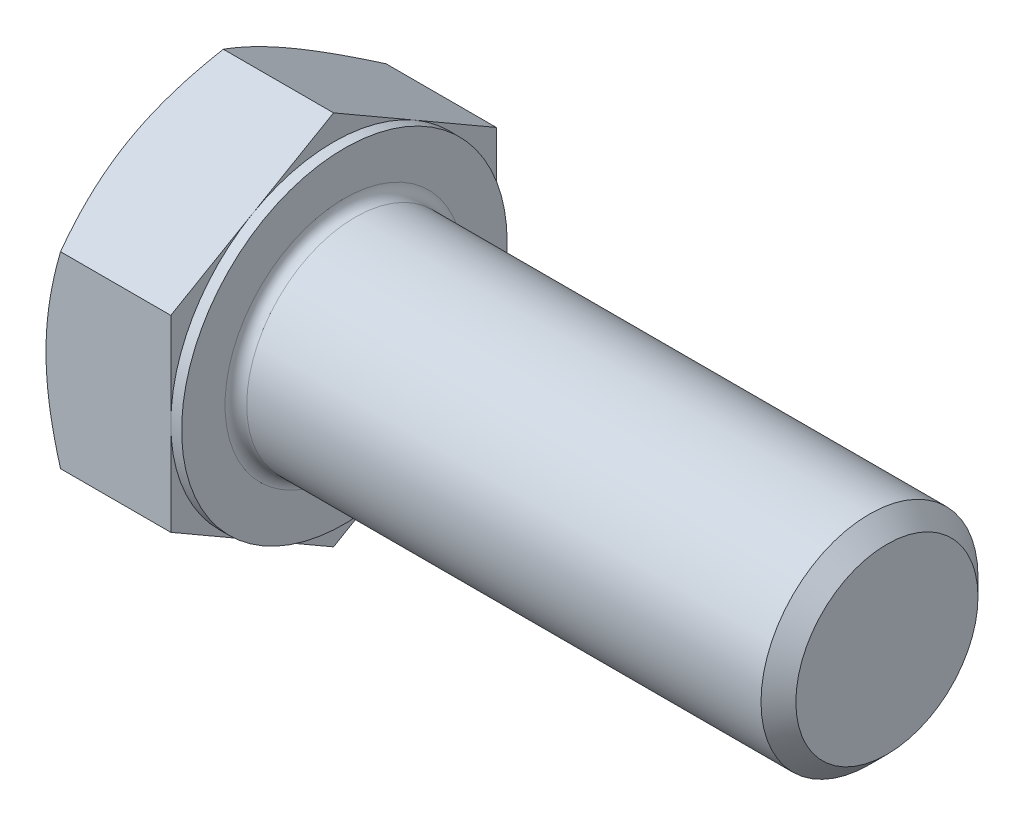
ISO-10303-21;
HEADER;
FILE_DESCRIPTION(('STEP AP214'),'2;1');
FILE_NAME('part.step','',(''),(''),'','','');
FILE_SCHEMA(('AUTOMOTIVE_DESIGN { 1 0 10303 214 1 1 1 1 }'));
ENDSEC;
DATA;
#1=APPLICATION_CONTEXT('core data for automotive mechanical design processes');
#2=APPLICATION_PROTOCOL_DEFINITION('international standard','automotive_design',2000,#1);
#3=PRODUCT_CONTEXT('',#1,'mechanical');
#4=PRODUCT('Part','Part','',(#3));
#5=PRODUCT_RELATED_PRODUCT_CATEGORY('part','',(#4));
#6=PRODUCT_DEFINITION_FORMATION('','',#4);
#7=PRODUCT_DEFINITION_CONTEXT('part definition',#1,'design');
#8=PRODUCT_DEFINITION('design','',#6,#7);
#9=PRODUCT_DEFINITION_SHAPE('','',#8);
#10=(LENGTH_UNIT() NAMED_UNIT(*) SI_UNIT(.MILLI.,.METRE.));
#11=(NAMED_UNIT(*) PLANE_ANGLE_UNIT() SI_UNIT($,.RADIAN.));
#12=(NAMED_UNIT(*) SI_UNIT($,.STERADIAN.) SOLID_ANGLE_UNIT());
#13=UNCERTAINTY_MEASURE_WITH_UNIT(LENGTH_MEASURE(1.E-05),#10,'distance_accuracy_value','');
#14=(GEOMETRIC_REPRESENTATION_CONTEXT(3) GLOBAL_UNCERTAINTY_ASSIGNED_CONTEXT((#13)) GLOBAL_UNIT_ASSIGNED_CONTEXT((#10,
#11,#12)) REPRESENTATION_CONTEXT('',''));
#15=CARTESIAN_POINT('',(0.,0.,0.));
#16=DIRECTION('',(0.,0.,1.));
#17=DIRECTION('',(1.,0.,0.));
#18=AXIS2_PLACEMENT_3D('',#15,#16,#17);
#19=CARTESIAN_POINT('',(-34.3920098802056,-1.76129453070666,6.98356337682071));
#20=DIRECTION('',(1.,0.,0.));
#21=DIRECTION('',(0.,0.,-1.));
#22=AXIS2_PLACEMENT_3D('',#19,#20,#21);
#23=PLANE('',#22);
#24=CARTESIAN_POINT('',(-34.3920098802056,-12.15359937612,6.98356337682071));
#25=DIRECTION('',(1.,0.,0.));
#26=DIRECTION('',(0.,0.,-1.));
#27=AXIS2_PLACEMENT_3D('',#24,#25,#26);
#28=CIRCLE('',#27,6.6);
#29=CARTESIAN_POINT('',(-34.3920098802056,-12.15359937612,0.38356337682071));
#30=VERTEX_POINT('',#29);
#31=EDGE_CURVE('E29',#30,#30,#28,.F.);
#32=ORIENTED_EDGE('',*,*,#31,.T.);
#33=EDGE_LOOP('',(#32));
#34=FACE_BOUND('',#33,.T.);
#35=CARTESIAN_POINT('',(-34.3920098802056,-12.15359937612,6.98356337682071));
#36=DIRECTION('',(1.,0.,0.));
#37=DIRECTION('',(0.,0.,-1.));
#38=AXIS2_PLACEMENT_3D('',#35,#36,#37);
#39=CIRCLE('',#38,9.);
#40=CARTESIAN_POINT('',(-34.3920098802056,-12.15359937612,-2.01643662317929));
#41=VERTEX_POINT('',#40);
#42=EDGE_CURVE('E205',#41,#41,#39,.T.);
#43=ORIENTED_EDGE('',*,*,#42,.T.);
#44=EDGE_LOOP('',(#43));
#45=FACE_BOUND('',#44,.T.);
#46=ADVANCED_FACE('F19',(#34,#45),#23,.T.);
#47=CARTESIAN_POINT('',(-41.8920098802056,-12.1535993761199,6.98356337682073));
#48=DIRECTION('',(-1.,0.,0.));
#49=DIRECTION('',(0.,0.,1.));
#50=AXIS2_PLACEMENT_3D('',#47,#48,#49);
#51=CYLINDRICAL_SURFACE('',#50,6.);
#52=CARTESIAN_POINT('',(-33.7920098802056,-12.1535993761199,6.98356337682073));
#53=DIRECTION('',(1.,0.,0.));
#54=DIRECTION('',(0.,0.,-1.));
#55=AXIS2_PLACEMENT_3D('',#52,#53,#54);
#56=CIRCLE('',#55,6.);
#57=CARTESIAN_POINT('',(-33.7920098802056,-12.1535993761199,0.983563376820724));
#58=VERTEX_POINT('',#57);
#59=EDGE_CURVE('E12',#58,#58,#56,.T.);
#60=ORIENTED_EDGE('',*,*,#59,.T.);
#61=EDGE_LOOP('',(#60));
#62=FACE_BOUND('',#61,.T.);
#63=CARTESIAN_POINT('',(-5.35600988020559,-12.15359937612,6.98356337682074));
#64=DIRECTION('',(-1.,0.,0.));
#65=DIRECTION('',(0.,0.,1.));
#66=AXIS2_PLACEMENT_3D('',#63,#64,#65);
#67=CIRCLE('',#66,6.);
#68=CARTESIAN_POINT('',(-5.35600988020559,-12.15359937612,12.9835633768207));
#69=VERTEX_POINT('',#68);
#70=EDGE_CURVE('E172',#69,#69,#67,.T.);
#71=ORIENTED_EDGE('',*,*,#70,.T.);
#72=EDGE_LOOP('',(#71));
#73=FACE_BOUND('',#72,.T.);
#74=ADVANCED_FACE('F413',(#62,#73),#51,.T.);
#75=CARTESIAN_POINT('',(-4.39200988020558,-12.1535993761199,6.98356337682073));
#76=DIRECTION('',(-1.,0.,0.));
#77=DIRECTION('',(0.,0.,1.));
#78=AXIS2_PLACEMENT_3D('',#75,#76,#77);
#79=CONICAL_SURFACE('',#78,5.036,0.785398163397445);
#80=ORIENTED_EDGE('',*,*,#70,.F.);
#81=EDGE_LOOP('',(#80));
#82=FACE_BOUND('',#81,.T.);
#83=CARTESIAN_POINT('',(-4.39200988020558,-12.1535993761199,6.98356337682073));
#84=DIRECTION('',(-1.,0.,0.));
#85=DIRECTION('',(0.,0.,1.));
#86=AXIS2_PLACEMENT_3D('',#83,#84,#85);
#87=CIRCLE('',#86,5.036);
#88=CARTESIAN_POINT('',(-4.39200988020558,-12.1535993761199,12.0195633768207));
#89=VERTEX_POINT('',#88);
#90=EDGE_CURVE('E179',#89,#89,#87,.T.);
#91=ORIENTED_EDGE('',*,*,#90,.T.);
#92=EDGE_LOOP('',(#91));
#93=FACE_BOUND('',#92,.T.);
#94=ADVANCED_FACE('F405',(#82,#93),#79,.T.);
#95=CARTESIAN_POINT('',(-4.39200988020558,-12.1535993761199,6.98356337682073));
#96=DIRECTION('',(-1.,0.,0.));
#97=DIRECTION('',(0.,0.,1.));
#98=AXIS2_PLACEMENT_3D('',#95,#96,#97);
#99=PLANE('',#98);
#100=ORIENTED_EDGE('',*,*,#90,.F.);
#101=EDGE_LOOP('',(#100));
#102=FACE_BOUND('',#101,.T.);
#103=ADVANCED_FACE('F407',(#102),#99,.F.);
#104=CARTESIAN_POINT('',(-34.9920098802056,-3.15359937611993,6.98356337682071));
#105=DIRECTION('',(1.,0.,0.));
#106=DIRECTION('',(0.,0.,-1.));
#107=AXIS2_PLACEMENT_3D('',#104,#105,#106);
#108=PLANE('',#107);
#109=DIRECTION('',(0.,0.500000000000001,0.866025403784438));
#110=VECTOR('',#109,1.);
#111=CARTESIAN_POINT('',(-34.9920098802056,-6.95744695341332,-2.01643662317927));
#112=LINE('',#111,#110);
#113=CARTESIAN_POINT('',(-34.9920098802056,-6.95744695341332,-2.01643662317927));
#114=VERTEX_POINT('',#113);
#115=CARTESIAN_POINT('',(-34.9920098802056,-4.35937074205999,2.48356337682071));
#116=VERTEX_POINT('',#115);
#117=EDGE_CURVE('E235',#114,#116,#112,.T.);
#118=ORIENTED_EDGE('',*,*,#117,.T.);
#119=CARTESIAN_POINT('',(-34.9920098802056,-12.1535993761199,6.98356337682073));
#120=DIRECTION('',(-1.,0.,0.));
#121=DIRECTION('',(0.,0.,1.));
#122=AXIS2_PLACEMENT_3D('',#119,#120,#121);
#123=CIRCLE('',#122,9.);
#124=CARTESIAN_POINT('',(-34.9920098802056,-12.15359937612,-2.01643662317928));
#125=VERTEX_POINT('',#124);
#126=EDGE_CURVE('E36',#116,#125,#123,.T.);
#127=ORIENTED_EDGE('',*,*,#126,.T.);
#128=DIRECTION('',(0.,1.,0.));
#129=VECTOR('',#128,1.);
#130=CARTESIAN_POINT('',(-34.9920098802056,-6.95744695341332,-2.01643662317927));
#131=LINE('',#130,#129);
#132=EDGE_CURVE('E211',#125,#114,#131,.T.);
#133=ORIENTED_EDGE('',*,*,#132,.T.);
#134=EDGE_LOOP('',(#118,#127,#133));
#135=FACE_BOUND('',#134,.T.);
#136=ADVANCED_FACE('F234',(#135),#108,.T.);
#137=CARTESIAN_POINT('',(-34.9920098802056,-1.76129453070667,6.98356337682071));
#138=VERTEX_POINT('',#137);
#139=EDGE_CURVE('E242',#116,#138,#112,.T.);
#140=ORIENTED_EDGE('',*,*,#139,.T.);
#141=DIRECTION('',(0.,-0.500000000000001,0.866025403784438));
#142=VECTOR('',#141,1.);
#143=CARTESIAN_POINT('',(-34.9920098802056,-1.76129453070667,6.98356337682071));
#144=LINE('',#143,#142);
#145=CARTESIAN_POINT('',(-34.9920098802056,-4.35937074205998,11.4835633768207));
#146=VERTEX_POINT('',#145);
#147=EDGE_CURVE('E250',#138,#146,#144,.T.);
#148=ORIENTED_EDGE('',*,*,#147,.T.);
#149=EDGE_CURVE('E141',#146,#116,#123,.T.);
#150=ORIENTED_EDGE('',*,*,#149,.T.);
#151=EDGE_LOOP('',(#140,#148,#150));
#152=FACE_BOUND('',#151,.T.);
#153=ADVANCED_FACE('F389',(#152),#108,.T.);
#154=CARTESIAN_POINT('',(-34.9920098802056,-6.95744695341331,15.9835633768207));
#155=VERTEX_POINT('',#154);
#156=EDGE_CURVE('E118',#146,#155,#144,.T.);
#157=ORIENTED_EDGE('',*,*,#156,.T.);
#158=DIRECTION('',(0.,-1.,0.));
#159=VECTOR('',#158,1.);
#160=CARTESIAN_POINT('',(-34.9920098802056,-6.95744695341331,15.9835633768207));
#161=LINE('',#160,#159);
#162=CARTESIAN_POINT('',(-34.9920098802056,-12.1535993761199,15.9835633768207));
#163=VERTEX_POINT('',#162);
#164=EDGE_CURVE('E112',#155,#163,#161,.T.);
#165=ORIENTED_EDGE('',*,*,#164,.T.);
#166=EDGE_CURVE('E116',#163,#146,#123,.T.);
#167=ORIENTED_EDGE('',*,*,#166,.T.);
#168=EDGE_LOOP('',(#157,#165,#167));
#169=FACE_BOUND('',#168,.T.);
#170=ADVANCED_FACE('F114',(#169),#108,.T.);
#171=CARTESIAN_POINT('',(-34.9920098802056,-17.3497517988265,15.9835633768207));
#172=VERTEX_POINT('',#171);
#173=EDGE_CURVE('E123',#163,#172,#161,.T.);
#174=ORIENTED_EDGE('',*,*,#173,.T.);
#175=DIRECTION('',(0.,-0.500000000000002,-0.866025403784438));
#176=VECTOR('',#175,1.);
#177=CARTESIAN_POINT('',(-34.9920098802056,-22.5459042215332,6.98356337682073));
#178=LINE('',#177,#176);
#179=CARTESIAN_POINT('',(-34.9920098802056,-19.9478280101799,11.4835633768207));
#180=VERTEX_POINT('',#179);
#181=EDGE_CURVE('E130',#172,#180,#178,.T.);
#182=ORIENTED_EDGE('',*,*,#181,.T.);
#183=EDGE_CURVE('E127',#180,#163,#123,.T.);
#184=ORIENTED_EDGE('',*,*,#183,.T.);
#185=EDGE_LOOP('',(#174,#182,#184));
#186=FACE_BOUND('',#185,.T.);
#187=ADVANCED_FACE('F128',(#186),#108,.T.);
#188=CARTESIAN_POINT('',(-34.9920098802056,-22.5459042215332,6.98356337682073));
#189=VERTEX_POINT('',#188);
#190=EDGE_CURVE('E151',#180,#189,#178,.T.);
#191=ORIENTED_EDGE('',*,*,#190,.T.);
#192=DIRECTION('',(0.,0.5,-0.866025403784439));
#193=VECTOR('',#192,1.);
#194=CARTESIAN_POINT('',(-34.9920098802056,-17.3497517988266,-2.01643662317929));
#195=LINE('',#194,#193);
#196=CARTESIAN_POINT('',(-34.9920098802056,-19.9478280101799,2.48356337682071));
#197=VERTEX_POINT('',#196);
#198=EDGE_CURVE('E375',#189,#197,#195,.T.);
#199=ORIENTED_EDGE('',*,*,#198,.T.);
#200=EDGE_CURVE('E135',#197,#180,#123,.T.);
#201=ORIENTED_EDGE('',*,*,#200,.T.);
#202=EDGE_LOOP('',(#191,#199,#201));
#203=FACE_BOUND('',#202,.T.);
#204=ADVANCED_FACE('F387',(#203),#108,.T.);
#205=CARTESIAN_POINT('',(-34.9920098802056,-17.3497517988266,-2.01643662317929));
#206=VERTEX_POINT('',#205);
#207=EDGE_CURVE('E143',#197,#206,#195,.T.);
#208=ORIENTED_EDGE('',*,*,#207,.T.);
#209=EDGE_CURVE('E214',#206,#125,#131,.T.);
#210=ORIENTED_EDGE('',*,*,#209,.T.);
#211=EDGE_CURVE('E226',#125,#197,#123,.T.);
#212=ORIENTED_EDGE('',*,*,#211,.T.);
#213=EDGE_LOOP('',(#208,#210,#212));
#214=FACE_BOUND('',#213,.T.);
#215=ADVANCED_FACE('F225',(#214),#108,.T.);
#216=CARTESIAN_POINT('',(-41.8920098802056,-12.1535993761199,6.98356337682073));
#217=DIRECTION('',(-1.,0.,0.));
#218=DIRECTION('',(0.,0.,1.));
#219=AXIS2_PLACEMENT_3D('',#216,#217,#218);
#220=CYLINDRICAL_SURFACE('',#219,9.);
#221=ORIENTED_EDGE('',*,*,#126,.F.);
#222=ORIENTED_EDGE('',*,*,#149,.F.);
#223=ORIENTED_EDGE('',*,*,#166,.F.);
#224=ORIENTED_EDGE('',*,*,#183,.F.);
#225=ORIENTED_EDGE('',*,*,#200,.F.);
#226=ORIENTED_EDGE('',*,*,#211,.F.);
#227=EDGE_LOOP('',(#221,#222,#223,#224,#225,#226));
#228=FACE_BOUND('',#227,.T.);
#229=ORIENTED_EDGE('',*,*,#42,.F.);
#230=EDGE_LOOP('',(#229));
#231=FACE_BOUND('',#230,.T.);
#232=ADVANCED_FACE('F138',(#228,#231),#220,.T.);
#233=CARTESIAN_POINT('',(-41.8920098802056,-1.76129453070667,6.98356337682073));
#234=DIRECTION('',(1.,0.,0.));
#235=DIRECTION('',(0.,0.,-1.));
#236=AXIS2_PLACEMENT_3D('',#233,#234,#235);
#237=PLANE('',#236);
#238=CARTESIAN_POINT('',(-41.8920098802056,-12.1535993761199,6.98356337682073));
#239=DIRECTION('',(1.,0.,0.));
#240=DIRECTION('',(0.,0.,-1.));
#241=AXIS2_PLACEMENT_3D('',#238,#239,#240);
#242=CIRCLE('',#241,9.);
#243=CARTESIAN_POINT('',(-41.8920098802056,-12.1535993761199,-2.01643662317929));
#244=VERTEX_POINT('',#243);
#245=CARTESIAN_POINT('',(-41.8920098802056,-4.35937074205998,2.48356337682069));
#246=VERTEX_POINT('',#245);
#247=EDGE_CURVE('E204',#244,#246,#242,.T.);
#248=ORIENTED_EDGE('',*,*,#247,.F.);
#249=CARTESIAN_POINT('',(-41.8920098802056,-19.9478280101799,2.48356337682069));
#250=VERTEX_POINT('',#249);
#251=EDGE_CURVE('E198',#250,#244,#242,.T.);
#252=ORIENTED_EDGE('',*,*,#251,.F.);
#253=CARTESIAN_POINT('',(-41.8920098802056,-19.9478280101799,11.4835633768207));
#254=VERTEX_POINT('',#253);
#255=EDGE_CURVE('E203',#254,#250,#242,.T.);
#256=ORIENTED_EDGE('',*,*,#255,.F.);
#257=CARTESIAN_POINT('',(-41.8920098802056,-12.1535993761199,15.9835633768207));
#258=VERTEX_POINT('',#257);
#259=EDGE_CURVE('E395',#258,#254,#242,.T.);
#260=ORIENTED_EDGE('',*,*,#259,.F.);
#261=CARTESIAN_POINT('',(-41.8920098802056,-12.1535993761199,6.98356337682073));
#262=DIRECTION('',(-1.,0.,0.));
#263=DIRECTION('',(0.,0.,1.));
#264=AXIS2_PLACEMENT_3D('',#261,#262,#263);
#265=CIRCLE('',#264,9.);
#266=CARTESIAN_POINT('',(-41.8920098802056,-4.35937074205998,11.4835633768207));
#267=VERTEX_POINT('',#266);
#268=EDGE_CURVE('E244',#258,#267,#265,.T.);
#269=ORIENTED_EDGE('',*,*,#268,.T.);
#270=EDGE_CURVE('E349',#246,#267,#242,.T.);
#271=ORIENTED_EDGE('',*,*,#270,.F.);
#272=EDGE_LOOP('',(#248,#252,#256,#260,#269,#271));
#273=FACE_BOUND('',#272,.T.);
#274=ADVANCED_FACE('F284',(#273),#237,.F.);
#275=CARTESIAN_POINT('',(-41.8920098802056,-12.1535993761199,6.98356337682073));
#276=DIRECTION('',(1.,0.,0.));
#277=DIRECTION('',(0.,0.,-1.));
#278=AXIS2_PLACEMENT_3D('',#275,#276,#277);
#279=CONICAL_SURFACE('',#278,9.,1.0471975511966);
#280=CARTESIAN_POINT('',(-41.0880956351344,-6.95756242346714,15.9837633768207));
#281=CARTESIAN_POINT('',(-41.1540278783315,-6.8433584719798,15.7859563304195));
#282=CARTESIAN_POINT('',(-41.2169684709953,-6.72870908676491,15.5873777701708));
#283=CARTESIAN_POINT('',(-41.3360408825501,-6.49847925883395,15.1886080107765));
#284=CARTESIAN_POINT('',(-41.3921697624535,-6.38289843701312,14.9884161550023));
#285=CARTESIAN_POINT('',(-41.4968579194766,-6.15059125900232,14.5860483197246));
#286=CARTESIAN_POINT('',(-41.5453991072928,-6.0338628498119,14.3838687843201));
#287=CARTESIAN_POINT('',(-41.6338613634177,-5.79961212135917,13.97813462093));
#288=CARTESIAN_POINT('',(-41.6737841927223,-5.68208996935378,13.7745802826418));
#289=CARTESIAN_POINT('',(-41.7433252060585,-5.44923143404666,13.3712574685138));
#290=CARTESIAN_POINT('',(-41.7731723773578,-5.33391225101851,13.1715187844217));
#291=CARTESIAN_POINT('',(-41.8232165703465,-5.10275789813208,12.7711477008317));
#292=CARTESIAN_POINT('',(-41.8434144446681,-4.98692277477666,12.5705153818791));
#293=CARTESIAN_POINT('',(-41.8736555328082,-4.75505160836675,12.1689027408469));
#294=CARTESIAN_POINT('',(-41.8837102706213,-4.63901594370157,11.9679230741568));
#295=CARTESIAN_POINT('',(-41.8934475450605,-4.40683782542977,11.5657787769043));
#296=CARTESIAN_POINT('',(-41.8931304021408,-4.29069537523331,11.3646141522485));
#297=CARTESIAN_POINT('',(-41.8828459280524,-4.07356352995785,10.9885307642902));
#298=CARTESIAN_POINT('',(-41.8741331401752,-3.97255882439997,10.8135854824604));
#299=CARTESIAN_POINT('',(-41.8490325401402,-3.77078600041822,10.4641046997374));
#300=CARTESIAN_POINT('',(-41.8326442106249,-3.67001789840243,10.2895692272637));
#301=CARTESIAN_POINT('',(-41.7723533239698,-3.36810370198083,9.76663849953521));
#302=CARTESIAN_POINT('',(-41.7173323978645,-3.16749201305057,9.41916886171579));
#303=CARTESIAN_POINT('',(-41.5797794038804,-2.76414061562264,8.72054374806671));
#304=CARTESIAN_POINT('',(-41.4966642615785,-2.56145238419256,8.36947743313354));
#305=CARTESIAN_POINT('',(-41.3080273407691,-2.15909850560767,7.6725800728021));
#306=CARTESIAN_POINT('',(-41.2025498673122,-1.95942770609856,7.32674010326443));
#307=CARTESIAN_POINT('',(-41.0880956351345,-1.76117906065282,6.98336337682071));
#308=B_SPLINE_CURVE_WITH_KNOTS('',3,(#280,#281,#282,#283,#284,#285,#286,#287,#288,#289,#290,
#291,#292,#293,#294,#295,#296,#297,#298,#299,#300,#301,#302,#303,#304,#305,#306,#307),
.UNSPECIFIED.,.F.,.F.,(4,2,2,2,2,2,2,2,2,2,2,2,2,4),(0.,0.713219249102576,1.42674513853509,
2.14194697262263,2.85700253034481,3.55449749123034,4.25193080859215,4.94857085059645,
5.64518936892663,6.25162976378284,6.85811104066341,8.07193747617895,9.31268391793543,
10.5509947443908),.UNSPECIFIED.);
#309=CARTESIAN_POINT('',(-41.0881623029122,-1.76129453070666,6.98356337682071));
#310=VERTEX_POINT('',#309);
#311=EDGE_CURVE('E306',#267,#310,#308,.T.);
#312=ORIENTED_EDGE('',*,*,#311,.T.);
#313=CARTESIAN_POINT('',(-41.0880956351345,-1.76117906065283,6.9837633768207));
#314=CARTESIAN_POINT('',(-41.1540278783315,-1.87538301214018,6.78595633041949));
#315=CARTESIAN_POINT('',(-41.2169684709953,-1.99003239735508,6.58737777017076));
#316=CARTESIAN_POINT('',(-41.3360408825501,-2.22026222528604,6.1886080107765));
#317=CARTESIAN_POINT('',(-41.3921697624535,-2.33584304710687,5.98841615500226));
#318=CARTESIAN_POINT('',(-41.4968579194766,-2.56815022511767,5.58604831972461));
#319=CARTESIAN_POINT('',(-41.5453991072928,-2.68487863430809,5.38386878432011));
#320=CARTESIAN_POINT('',(-41.6338613634177,-2.91912936276082,4.97813462092996));
#321=CARTESIAN_POINT('',(-41.6737841927223,-3.03665151476621,4.7745802826418));
#322=CARTESIAN_POINT('',(-41.7433252060585,-3.26951005007333,4.37125746851379));
#323=CARTESIAN_POINT('',(-41.7731723773578,-3.38482923310148,4.17151878442171));
#324=CARTESIAN_POINT('',(-41.8232165703465,-3.6159835859879,3.77114770083171));
#325=CARTESIAN_POINT('',(-41.843414444668,-3.73181870934333,3.5705153818791));
#326=CARTESIAN_POINT('',(-41.8736555328082,-3.96368987575324,3.16890274084689));
#327=CARTESIAN_POINT('',(-41.8837102706213,-4.07972554041842,2.96792307415678));
#328=CARTESIAN_POINT('',(-41.8934475450605,-4.31190365869021,2.56577877690429));
#329=CARTESIAN_POINT('',(-41.8931304021408,-4.42804610888666,2.36461415224849));
#330=CARTESIAN_POINT('',(-41.8828459280524,-4.64517795416212,1.98853076429021));
#331=CARTESIAN_POINT('',(-41.8741331401752,-4.74618265972001,1.81358548246042));
#332=CARTESIAN_POINT('',(-41.8490325401402,-4.94795548370177,1.46410469973737));
#333=CARTESIAN_POINT('',(-41.8326442106249,-5.04872358571755,1.28956922726374));
#334=CARTESIAN_POINT('',(-41.7723533239698,-5.35063778213915,0.766638499535211));
#335=CARTESIAN_POINT('',(-41.7173323978645,-5.55124947106941,0.419168861715802));
#336=CARTESIAN_POINT('',(-41.5797794038804,-5.95460086849734,-0.27945625193328));
#337=CARTESIAN_POINT('',(-41.4966642615785,-6.15728909992742,-0.630522566866451));
#338=CARTESIAN_POINT('',(-41.3080273407691,-6.55964297851231,-1.32741992719788));
#339=CARTESIAN_POINT('',(-41.2025498673122,-6.75931377802141,-1.67325989673556));
#340=CARTESIAN_POINT('',(-41.0880956351345,-6.95756242346714,-2.01663662317928));
#341=B_SPLINE_CURVE_WITH_KNOTS('',3,(#313,#314,#315,#316,#317,#318,#319,#320,#321,#322,#323,
#324,#325,#326,#327,#328,#329,#330,#331,#332,#333,#334,#335,#336,#337,#338,#339,#340),
.UNSPECIFIED.,.F.,.F.,(4,2,2,2,2,2,2,2,2,2,2,2,2,4),(0.,0.713219249102579,1.42674513853509,
2.14194697262263,2.85700253034481,3.55449749123034,4.25193080859215,4.94857085059645,
5.64518936892663,6.25162976378284,6.8581110406634,8.07193747617893,9.31268391793541,
10.5509947443908),.UNSPECIFIED.);
#342=EDGE_CURVE('E44',#310,#246,#341,.T.);
#343=ORIENTED_EDGE('',*,*,#342,.T.);
#344=ORIENTED_EDGE('',*,*,#270,.T.);
#345=EDGE_LOOP('',(#312,#343,#344));
#346=FACE_BOUND('',#345,.T.);
#347=ADVANCED_FACE('F347',(#346),#279,.T.);
#348=CARTESIAN_POINT('',(-37.3889264290428,-26.3389978411214,15.9835633768207));
#349=CARTESIAN_POINT('',(-37.5814655757678,-25.9439493283551,15.9835633768207));
#350=CARTESIAN_POINT('',(-37.7722234043359,-25.5480180957466,15.9835633768207));
#351=CARTESIAN_POINT('',(-38.1491789740032,-24.7539216027954,15.9835633768207));
#352=CARTESIAN_POINT('',(-38.3353760387397,-24.3557560217312,15.9835633768207));
#353=CARTESIAN_POINT('',(-38.7031013167597,-23.5547777726928,15.9835633768207));
#354=CARTESIAN_POINT('',(-38.8846004895291,-23.1519517278315,15.9835633768207));
#355=CARTESIAN_POINT('',(-39.2404699933911,-22.3431746426352,15.9835633768207));
#356=CARTESIAN_POINT('',(-39.4148406466211,-21.9372237444996,15.9835633768207));
#357=CARTESIAN_POINT('',(-39.7603974309363,-21.1075812680139,15.9835633768207));
#358=CARTESIAN_POINT('',(-39.9312698661221,-20.6837583292793,15.9835633768207));
#359=CARTESIAN_POINT('',(-40.260625779973,-19.8312397801505,15.9835633768207));
#360=CARTESIAN_POINT('',(-40.419107900436,-19.402543641449,15.9835633768207));
#361=CARTESIAN_POINT('',(-40.7196883288262,-18.5403230075001,15.9835633768207));
#362=CARTESIAN_POINT('',(-40.8618179354609,-18.1068095382505,15.9835633768207));
#363=CARTESIAN_POINT('',(-41.1252852118159,-17.2335827370762,15.9835633768207));
#364=CARTESIAN_POINT('',(-41.2466291947535,-16.7938713317225,15.9835633768207));
#365=CARTESIAN_POINT('',(-41.4621872801644,-15.9104244338169,15.9835633768207));
#366=CARTESIAN_POINT('',(-41.5565572937591,-15.4667280144055,15.9835633768207));
#367=CARTESIAN_POINT('',(-41.6739197702078,-14.7969665091765,15.9835633768207));
#368=CARTESIAN_POINT('',(-41.7090100180472,-14.5729949831565,15.9835633768207));
#369=CARTESIAN_POINT('',(-41.7704442128478,-14.1238629199868,15.9835633768207));
#370=CARTESIAN_POINT('',(-41.7967890100851,-13.8987025005911,15.9835633768207));
#371=CARTESIAN_POINT('',(-41.8398647329777,-13.4505341849115,15.9835633768207));
#372=CARTESIAN_POINT('',(-41.8567209003413,-13.2275383780695,15.9835633768207));
#373=CARTESIAN_POINT('',(-41.8809788162713,-12.7810329768831,15.9835633768207));
#374=CARTESIAN_POINT('',(-41.8883807281163,-12.5575233914786,15.9835633768207));
#375=CARTESIAN_POINT('',(-41.8935525039978,-12.1103914399454,15.9835633768207));
#376=CARTESIAN_POINT('',(-41.89132239956,-11.8867690741884,15.9835633768207));
#377=CARTESIAN_POINT('',(-41.8772872724821,-11.4398225032959,15.9835633768207));
#378=CARTESIAN_POINT('',(-41.8654818142583,-11.2164983121874,15.9835633768207));
#379=CARTESIAN_POINT('',(-41.8263595903484,-10.6865272571536,15.9835633768207));
#380=CARTESIAN_POINT('',(-41.7948751124765,-10.3801809255519,15.9835633768207));
#381=CARTESIAN_POINT('',(-41.7155555469676,-9.76962909603027,15.9835633768207));
#382=CARTESIAN_POINT('',(-41.6677184224878,-9.46542386962044,15.9835633768207));
#383=CARTESIAN_POINT('',(-41.5022034772403,-8.55644124495319,15.9835633768207));
#384=CARTESIAN_POINT('',(-41.3625479833592,-7.95560524959762,15.9835633768207));
#385=CARTESIAN_POINT('',(-41.1186780083566,-7.05689231263183,15.9835633768207));
#386=CARTESIAN_POINT('',(-41.0304774490629,-6.75440027068798,15.9835633768207));
#387=CARTESIAN_POINT('',(-40.8444888881739,-6.15234911509998,15.9835633768207));
#388=CARTESIAN_POINT('',(-40.7467008181362,-5.85279002241009,15.9835633768207));
#389=CARTESIAN_POINT('',(-40.5431412198106,-5.25651878840651,15.9835633768207));
#390=CARTESIAN_POINT('',(-40.4373720033055,-4.95980585054206,15.9835633768207));
#391=CARTESIAN_POINT('',(-40.2191368605182,-4.36886650225549,15.9835633768207));
#392=CARTESIAN_POINT('',(-40.1066710454727,-4.07464005062323,15.9835633768207));
#393=CARTESIAN_POINT('',(-39.816772527491,-3.33740492710144,15.9835633768207));
#394=CARTESIAN_POINT('',(-39.6357152100917,-2.89582353203097,15.9835633768207));
#395=CARTESIAN_POINT('',(-39.2637346575747,-2.01682172496217,15.9835633768207));
#396=CARTESIAN_POINT('',(-39.0728105931536,-1.57940166639622,15.9835633768207));
#397=CARTESIAN_POINT('',(-38.6832302464907,-0.707870726407691,15.9835633768207));
#398=CARTESIAN_POINT('',(-38.4845716491291,-0.273760883032783,15.9835633768207));
#399=CARTESIAN_POINT('',(-38.0812125081484,0.591618570787615,15.9835633768207));
#400=CARTESIAN_POINT('',(-37.8765121451825,1.02288826568497,15.9835633768207));
#401=CARTESIAN_POINT('',(-37.4620021051957,1.88368333805584,15.9835633768207));
#402=CARTESIAN_POINT('',(-37.2521858580026,2.31320554550507,15.9835633768207));
#403=CARTESIAN_POINT('',(-36.8286411668127,3.17031689333842,15.9835633768207));
#404=CARTESIAN_POINT('',(-36.6149126992123,3.59790602204035,15.9835633768207));
#405=CARTESIAN_POINT('',(-36.1842969841146,4.45139576632226,15.9835633768207));
#406=CARTESIAN_POINT('',(-35.9674102914385,4.87729666214953,15.9835633768207));
#407=CARTESIAN_POINT('',(-35.5309929476307,5.72774244785171,15.9835633768207));
#408=CARTESIAN_POINT('',(-35.3114622854761,6.15228733206406,15.9835633768207));
#409=CARTESIAN_POINT('',(-34.6910429866451,7.34452463560537,15.9835633768207));
#410=CARTESIAN_POINT('',(-34.2876476459569,8.11091246147882,15.9835633768207));
#411=CARTESIAN_POINT('',(-33.4755424031705,9.64090721644789,15.9835633768207));
#412=CARTESIAN_POINT('',(-33.0668322479996,10.4045140108881,15.9835633768207));
#413=CARTESIAN_POINT('',(-32.246619959021,11.9272860480201,15.9835633768207));
#414=CARTESIAN_POINT('',(-31.8351297995221,12.6864577448679,15.9835633768207));
#415=CARTESIAN_POINT('',(-31.2155865126564,13.8239238136889,15.9835633768207));
#416=CARTESIAN_POINT('',(-31.0086942899067,14.2028514127866,15.9835633768207));
#417=CARTESIAN_POINT('',(-30.594219169917,14.9603279995175,15.9835633768207));
#418=CARTESIAN_POINT('',(-30.38663627369,15.338876987705,15.9835633768207));
#419=CARTESIAN_POINT('',(-30.1787492999222,15.7172589586545,15.9835633768207));
#420=B_SPLINE_CURVE_WITH_KNOTS('',3,(#348,#349,#350,#351,#352,#353,#354,#355,#356,#357,#358,
#359,#360,#361,#362,#363,#364,#365,#366,#367,#368,#369,#370,#371,#372,#373,#374,#375,#376,#377,
#378,#379,#380,#381,#382,#383,#384,#385,#386,#387,#388,#389,#390,#391,#392,#393,#394,#395,#396,
#397,#398,#399,#400,#401,#402,#403,#404,#405,#406,#407,#408,#409,#410,#411,#412,#413,#414,#415,
#416,#417,#418,#419),.UNSPECIFIED.,.F.,.F.,(4,2,2,2,2,2,2,2,2,2,2,2,2,2,2,2,2,2,2,2,2,2,2,2,2,2,
2,2,2,2,2,2,2,2,2,4),(0.,1.31842765114838,2.6370496560634,3.96247407620816,5.28783853415269,
6.65860358746621,8.02951869129604,9.39776460603695,10.7655942037288,12.1253499441535,
12.8053173169584,13.485218560578,14.1559216013657,14.8266130586982,15.4973023208461,
16.1680220944284,17.0913849082023,18.0148627755644,19.862742604473,20.8079230410616,
21.7531102255101,22.6980246745778,23.6429234321322,25.0745302305723,26.5062575523684,
27.9384167676661,29.3705332036397,30.8045973553515,32.2386701620091,33.6724940065179,
35.1063238307244,37.7045032490067,40.3028068397953,42.8933552129343,44.1885437295509,
45.4837303472314),.UNSPECIFIED.);
#421=CARTESIAN_POINT('',(-41.0881623029122,-6.95744695341331,15.9835633768207));
#422=VERTEX_POINT('',#421);
#423=EDGE_CURVE('E323',#258,#422,#420,.T.);
#424=ORIENTED_EDGE('',*,*,#423,.T.);
#425=EDGE_CURVE('E340',#422,#267,#308,.T.);
#426=ORIENTED_EDGE('',*,*,#425,.T.);
#427=ORIENTED_EDGE('',*,*,#268,.F.);
#428=EDGE_LOOP('',(#424,#426,#427));
#429=FACE_BOUND('',#428,.T.);
#430=ADVANCED_FACE('F396',(#429),#279,.T.);
#431=CARTESIAN_POINT('',(-41.0881623029122,-17.3497517988265,15.9835633768207));
#432=VERTEX_POINT('',#431);
#433=EDGE_CURVE('E331',#432,#258,#420,.T.);
#434=ORIENTED_EDGE('',*,*,#433,.T.);
#435=ORIENTED_EDGE('',*,*,#259,.T.);
#436=CARTESIAN_POINT('',(-41.0880956351345,-22.546019691587,6.98336337682071));
#437=CARTESIAN_POINT('',(-41.1540278783315,-22.4318157400997,7.18117042322193));
#438=CARTESIAN_POINT('',(-41.2169684709953,-22.3171663548848,7.37974898347066));
#439=CARTESIAN_POINT('',(-41.33604088255,-22.0869365269538,7.77851874286493));
#440=CARTESIAN_POINT('',(-41.3921697624535,-21.971355705133,7.97871059863917));
#441=CARTESIAN_POINT('',(-41.4968579194766,-21.7390485271222,8.38107843391682));
#442=CARTESIAN_POINT('',(-41.5453991072928,-21.6223201179318,8.58325796932132));
#443=CARTESIAN_POINT('',(-41.6338613634177,-21.3880693894791,8.98899213271147));
#444=CARTESIAN_POINT('',(-41.6737841927223,-21.2705472374737,9.19254647099963));
#445=CARTESIAN_POINT('',(-41.7433252060585,-21.0376887021665,9.59586928512764));
#446=CARTESIAN_POINT('',(-41.7731723773578,-20.9223695191384,9.79560796921972));
#447=CARTESIAN_POINT('',(-41.8232165703465,-20.691215166252,10.1959790528097));
#448=CARTESIAN_POINT('',(-41.843414444668,-20.5753800428965,10.3966113717623));
#449=CARTESIAN_POINT('',(-41.8736555328082,-20.3435088764866,10.7982240127945));
#450=CARTESIAN_POINT('',(-41.8837102706213,-20.2274732118215,10.9992036794847));
#451=CARTESIAN_POINT('',(-41.8934475450605,-19.9952950935497,11.4013479767371));
#452=CARTESIAN_POINT('',(-41.8931304021408,-19.8791526433532,11.6025126013929));
#453=CARTESIAN_POINT('',(-41.8828459280524,-19.6620207980777,11.9785959893512));
#454=CARTESIAN_POINT('',(-41.8741331401752,-19.5610160925198,12.153541271181));
#455=CARTESIAN_POINT('',(-41.8490325401402,-19.3592432685381,12.5030220539041));
#456=CARTESIAN_POINT('',(-41.8326442106249,-19.2584751665223,12.6775575263777));
#457=CARTESIAN_POINT('',(-41.7723533239698,-18.9565609701007,13.2004882541062));
#458=CARTESIAN_POINT('',(-41.7173323978645,-18.7559492811705,13.5479578919256));
#459=CARTESIAN_POINT('',(-41.5797794038804,-18.3525978837425,14.2465830055747));
#460=CARTESIAN_POINT('',(-41.4966642615785,-18.1499096523124,14.5976493205079));
#461=CARTESIAN_POINT('',(-41.3080273407691,-17.7475557737276,15.2945466808393));
#462=CARTESIAN_POINT('',(-41.2025498673122,-17.5478849742184,15.640386650377));
#463=CARTESIAN_POINT('',(-41.0880956351345,-17.3496363287727,15.9837633768207));
#464=B_SPLINE_CURVE_WITH_KNOTS('',3,(#436,#437,#438,#439,#440,#441,#442,#443,#444,#445,#446,
#447,#448,#449,#450,#451,#452,#453,#454,#455,#456,#457,#458,#459,#460,#461,#462,#463),
.UNSPECIFIED.,.F.,.F.,(4,2,2,2,2,2,2,2,2,2,2,2,2,4),(0.,0.713219249102578,1.42674513853509,
2.14194697262264,2.85700253034481,3.55449749123035,4.25193080859215,4.94857085059646,
5.64518936892664,6.25162976378285,6.85811104066342,8.07193747617895,9.31268391793542,
10.5509947443908),.UNSPECIFIED.);
#465=EDGE_CURVE('E308',#254,#432,#464,.T.);
#466=ORIENTED_EDGE('',*,*,#465,.T.);
#467=EDGE_LOOP('',(#434,#435,#466));
#468=FACE_BOUND('',#467,.T.);
#469=ADVANCED_FACE('F275',(#468),#279,.T.);
#470=CARTESIAN_POINT('',(-41.0881623029122,-22.5459042215332,6.98356337682071));
#471=VERTEX_POINT('',#470);
#472=EDGE_CURVE('E298',#471,#254,#464,.T.);
#473=ORIENTED_EDGE('',*,*,#472,.T.);
#474=ORIENTED_EDGE('',*,*,#255,.T.);
#475=CARTESIAN_POINT('',(-41.0880956351345,-17.3496363287727,-2.01663662317927));
#476=CARTESIAN_POINT('',(-41.1540278783315,-17.4638402802601,-1.81882957677806));
#477=CARTESIAN_POINT('',(-41.2169684709953,-17.578489665475,-1.62025101652933));
#478=CARTESIAN_POINT('',(-41.33604088255,-17.8087194934059,-1.22148125713507));
#479=CARTESIAN_POINT('',(-41.3921697624535,-17.9243003152268,-1.02128940136083));
#480=CARTESIAN_POINT('',(-41.4968579194766,-18.1566074932376,-0.618921566083181));
#481=CARTESIAN_POINT('',(-41.5453991072928,-18.273335902428,-0.416742030678682));
#482=CARTESIAN_POINT('',(-41.6338613634177,-18.5075866308807,-0.0110078672885333));
#483=CARTESIAN_POINT('',(-41.6737841927223,-18.6251087828861,0.192546470999631));
#484=CARTESIAN_POINT('',(-41.7433252060585,-18.8579673181932,0.595869285127636));
#485=CARTESIAN_POINT('',(-41.7731723773578,-18.9732865012214,0.795607969219725));
#486=CARTESIAN_POINT('',(-41.8232165703465,-19.2044408541078,1.19597905280972));
#487=CARTESIAN_POINT('',(-41.843414444668,-19.3202759774632,1.39661137176233));
#488=CARTESIAN_POINT('',(-41.8736555328082,-19.5521471438731,1.79822401279454));
#489=CARTESIAN_POINT('',(-41.8837102706213,-19.6681828085383,1.99920367948465));
#490=CARTESIAN_POINT('',(-41.8934475450605,-19.9003609268101,2.40134797673715));
#491=CARTESIAN_POINT('',(-41.8931304021408,-20.0165033770065,2.60251260139296));
#492=CARTESIAN_POINT('',(-41.8828459280524,-20.233635222282,2.97859598935123));
#493=CARTESIAN_POINT('',(-41.8741331401752,-20.3346399278399,3.15354127118101));
#494=CARTESIAN_POINT('',(-41.8490325401402,-20.5364127518217,3.50302205390406));
#495=CARTESIAN_POINT('',(-41.8326442106249,-20.6371808538375,3.67755752637769));
#496=CARTESIAN_POINT('',(-41.7723533239697,-20.939095050259,4.20048825410622));
#497=CARTESIAN_POINT('',(-41.7173323978644,-21.1397067391893,4.54795789192563));
#498=CARTESIAN_POINT('',(-41.5797794038804,-21.5430581366172,5.24658300557471));
#499=CARTESIAN_POINT('',(-41.4966642615785,-21.7457463680473,5.59764932050788));
#500=CARTESIAN_POINT('',(-41.3080273407691,-22.1481002466322,6.29454668083932));
#501=CARTESIAN_POINT('',(-41.2025498673122,-22.3477710461413,6.640386650377));
#502=CARTESIAN_POINT('',(-41.0880956351345,-22.546019691587,6.98376337682073));
#503=B_SPLINE_CURVE_WITH_KNOTS('',3,(#475,#476,#477,#478,#479,#480,#481,#482,#483,#484,#485,
#486,#487,#488,#489,#490,#491,#492,#493,#494,#495,#496,#497,#498,#499,#500,#501,#502),
.UNSPECIFIED.,.F.,.F.,(4,2,2,2,2,2,2,2,2,2,2,2,2,4),(0.,0.713219249102576,1.42674513853509,
2.14194697262263,2.8570025303448,3.55449749123034,4.25193080859215,4.94857085059645,
5.64518936892662,6.25162976378283,6.8581110406634,8.07193747617893,9.3126839179354,
10.5509947443907),.UNSPECIFIED.);
#504=EDGE_CURVE('E307',#250,#471,#503,.T.);
#505=ORIENTED_EDGE('',*,*,#504,.T.);
#506=EDGE_LOOP('',(#473,#474,#505));
#507=FACE_BOUND('',#506,.T.);
#508=ADVANCED_FACE('F370',(#507),#279,.T.);
#509=CARTESIAN_POINT('',(-41.0881623029122,-6.95744695341331,-2.01643662317928));
#510=VERTEX_POINT('',#509);
#511=EDGE_CURVE('E309',#246,#510,#341,.T.);
#512=ORIENTED_EDGE('',*,*,#511,.T.);
#513=CARTESIAN_POINT('',(-37.3889264290428,-26.3389978411214,-2.01643662317928));
#514=CARTESIAN_POINT('',(-37.5814655757677,-25.9439493283551,-2.01643662317928));
#515=CARTESIAN_POINT('',(-37.7722234043358,-25.5480180957466,-2.01643662317928));
#516=CARTESIAN_POINT('',(-38.1491789740032,-24.7539216027954,-2.01643662317928));
#517=CARTESIAN_POINT('',(-38.3353760387396,-24.3557560217312,-2.01643662317928));
#518=CARTESIAN_POINT('',(-38.7031013167597,-23.5547777726929,-2.01643662317928));
#519=CARTESIAN_POINT('',(-38.8846004895291,-23.1519517278315,-2.01643662317928));
#520=CARTESIAN_POINT('',(-39.2404699933911,-22.3431746426353,-2.01643662317928));
#521=CARTESIAN_POINT('',(-39.414840646621,-21.9372237444996,-2.01643662317928));
#522=CARTESIAN_POINT('',(-39.7603974309363,-21.107581268014,-2.01643662317928));
#523=CARTESIAN_POINT('',(-39.9312698661221,-20.6837583292793,-2.01643662317928));
#524=CARTESIAN_POINT('',(-40.260625779973,-19.8312397801506,-2.01643662317928));
#525=CARTESIAN_POINT('',(-40.419107900436,-19.402543641449,-2.01643662317928));
#526=CARTESIAN_POINT('',(-40.7196883288262,-18.5403230075001,-2.01643662317928));
#527=CARTESIAN_POINT('',(-40.8618179354609,-18.1068095382506,-2.01643662317928));
#528=CARTESIAN_POINT('',(-41.1252852118159,-17.2335827370762,-2.01643662317929));
#529=CARTESIAN_POINT('',(-41.2466291947535,-16.7938713317225,-2.0164366231793));
#530=CARTESIAN_POINT('',(-41.4621872801644,-15.9104244338169,-2.0164366231793));
#531=CARTESIAN_POINT('',(-41.5565572937591,-15.4667280144055,-2.01643662317928));
#532=CARTESIAN_POINT('',(-41.6739197702078,-14.7969665091766,-2.01643662317928));
#533=CARTESIAN_POINT('',(-41.7090100180472,-14.5729949831565,-2.01643662317928));
#534=CARTESIAN_POINT('',(-41.7704442128477,-14.1238629199869,-2.01643662317928));
#535=CARTESIAN_POINT('',(-41.7967890100851,-13.8987025005911,-2.01643662317928));
#536=CARTESIAN_POINT('',(-41.8398647329777,-13.4505341849116,-2.01643662317928));
#537=CARTESIAN_POINT('',(-41.8567209003413,-13.2275383780696,-2.01643662317928));
#538=CARTESIAN_POINT('',(-41.8809788162713,-12.7810329768831,-2.01643662317928));
#539=CARTESIAN_POINT('',(-41.8883807281163,-12.5575233914786,-2.01643662317928));
#540=CARTESIAN_POINT('',(-41.8935525039978,-12.1103914399454,-2.01643662317928));
#541=CARTESIAN_POINT('',(-41.89132239956,-11.8867690741884,-2.01643662317928));
#542=CARTESIAN_POINT('',(-41.8772872724821,-11.4398225032959,-2.01643662317928));
#543=CARTESIAN_POINT('',(-41.8654818142583,-11.2164983121873,-2.01643662317928));
#544=CARTESIAN_POINT('',(-41.8263595903484,-10.6865272571536,-2.01643662317928));
#545=CARTESIAN_POINT('',(-41.7948751124765,-10.3801809255519,-2.01643662317928));
#546=CARTESIAN_POINT('',(-41.7155555469676,-9.76962909603027,-2.01643662317928));
#547=CARTESIAN_POINT('',(-41.6677184224878,-9.46542386962044,-2.01643662317928));
#548=CARTESIAN_POINT('',(-41.5022034772403,-8.55644124495319,-2.01643662317928));
#549=CARTESIAN_POINT('',(-41.3625479833592,-7.95560524959762,-2.01643662317928));
#550=CARTESIAN_POINT('',(-41.1186780083566,-7.05689231263184,-2.01643662317928));
#551=CARTESIAN_POINT('',(-41.0304774490629,-6.75440027068799,-2.01643662317928));
#552=CARTESIAN_POINT('',(-40.8444888881739,-6.1523491151,-2.01643662317928));
#553=CARTESIAN_POINT('',(-40.7467008181362,-5.8527900224101,-2.01643662317928));
#554=CARTESIAN_POINT('',(-40.5431412198106,-5.25651878840654,-2.01643662317928));
#555=CARTESIAN_POINT('',(-40.4373720033055,-4.95980585054209,-2.01643662317929));
#556=CARTESIAN_POINT('',(-40.2191368605182,-4.36886650225552,-2.01643662317928));
#557=CARTESIAN_POINT('',(-40.1066710454727,-4.07464005062326,-2.01643662317927));
#558=CARTESIAN_POINT('',(-39.8167725274911,-3.33740492710147,-2.01643662317927));
#559=CARTESIAN_POINT('',(-39.6357152100917,-2.89582353203101,-2.01643662317928));
#560=CARTESIAN_POINT('',(-39.2637346575747,-2.01682172496222,-2.01643662317929));
#561=CARTESIAN_POINT('',(-39.0728105931536,-1.57940166639626,-2.01643662317928));
#562=CARTESIAN_POINT('',(-38.6832302464907,-0.707870726407732,-2.01643662317928));
#563=CARTESIAN_POINT('',(-38.4845716491291,-0.273760883032825,-2.01643662317928));
#564=CARTESIAN_POINT('',(-38.0812125081484,0.591618570787572,-2.01643662317928));
#565=CARTESIAN_POINT('',(-37.8765121451825,1.02288826568493,-2.01643662317928));
#566=CARTESIAN_POINT('',(-37.4620021051957,1.8836833380558,-2.01643662317928));
#567=CARTESIAN_POINT('',(-37.2521858580027,2.31320554550503,-2.01643662317928));
#568=CARTESIAN_POINT('',(-36.8286411668127,3.17031689333838,-2.01643662317928));
#569=CARTESIAN_POINT('',(-36.6149126992123,3.5979060220403,-2.01643662317928));
#570=CARTESIAN_POINT('',(-36.1842969841146,4.45139576632222,-2.01643662317928));
#571=CARTESIAN_POINT('',(-35.9674102914385,4.87729666214949,-2.01643662317928));
#572=CARTESIAN_POINT('',(-35.5309929476307,5.72774244785167,-2.01643662317928));
#573=CARTESIAN_POINT('',(-35.3114622854761,6.15228733206402,-2.01643662317928));
#574=CARTESIAN_POINT('',(-34.6910429866452,7.34452463560532,-2.01643662317928));
#575=CARTESIAN_POINT('',(-34.2876476459569,8.11091246147878,-2.01643662317928));
#576=CARTESIAN_POINT('',(-33.4755424031705,9.64090721644786,-2.01643662317928));
#577=CARTESIAN_POINT('',(-33.0668322479996,10.404514010888,-2.01643662317928));
#578=CARTESIAN_POINT('',(-32.246619959021,11.9272860480201,-2.01643662317928));
#579=CARTESIAN_POINT('',(-31.8351297995221,12.6864577448679,-2.01643662317928));
#580=CARTESIAN_POINT('',(-31.2155865126564,13.8239238136888,-2.01643662317928));
#581=CARTESIAN_POINT('',(-31.0086942899068,14.2028514127866,-2.01643662317929));
#582=CARTESIAN_POINT('',(-30.594219169917,14.9603279995175,-2.01643662317928));
#583=CARTESIAN_POINT('',(-30.38663627369,15.338876987705,-2.01643662317928));
#584=CARTESIAN_POINT('',(-30.1787492999222,15.7172589586545,-2.01643662317927));
#585=B_SPLINE_CURVE_WITH_KNOTS('',3,(#513,#514,#515,#516,#517,#518,#519,#520,#521,#522,#523,
#524,#525,#526,#527,#528,#529,#530,#531,#532,#533,#534,#535,#536,#537,#538,#539,#540,#541,#542,
#543,#544,#545,#546,#547,#548,#549,#550,#551,#552,#553,#554,#555,#556,#557,#558,#559,#560,#561,
#562,#563,#564,#565,#566,#567,#568,#569,#570,#571,#572,#573,#574,#575,#576,#577,#578,#579,#580,
#581,#582,#583,#584),.UNSPECIFIED.,.F.,.F.,(4,2,2,2,2,2,2,2,2,2,2,2,2,2,2,2,2,2,2,2,2,2,2,2,2,2,
2,2,2,2,2,2,2,2,2,4),(0.,1.31842765114838,2.63704965606341,3.96247407620816,5.28783853415269,
6.6586035874662,8.02951869129604,9.39776460603694,10.7655942037288,12.1253499441535,
12.8053173169584,13.485218560578,14.1559216013658,14.8266130586982,15.4973023208461,
16.1680220944285,17.0913849082024,18.0148627755644,19.8627426044731,20.8079230410616,
21.7531102255101,22.6980246745778,23.6429234321322,25.0745302305723,26.5062575523684,
27.9384167676661,29.3705332036396,30.8045973553514,32.2386701620091,33.6724940065179,
35.1063238307244,37.7045032490067,40.3028068397952,42.8933552129343,44.1885437295509,
45.4837303472314),.UNSPECIFIED.);
#586=EDGE_CURVE('E266',#510,#244,#585,.F.);
#587=ORIENTED_EDGE('',*,*,#586,.T.);
#588=ORIENTED_EDGE('',*,*,#247,.T.);
#589=EDGE_LOOP('',(#512,#587,#588));
#590=FACE_BOUND('',#589,.T.);
#591=ADVANCED_FACE('F364',(#590),#279,.T.);
#592=CARTESIAN_POINT('',(-41.0881623029125,-17.349751798827,-2.0164366231793));
#593=VERTEX_POINT('',#592);
#594=EDGE_CURVE('E267',#593,#250,#503,.T.);
#595=ORIENTED_EDGE('',*,*,#594,.T.);
#596=ORIENTED_EDGE('',*,*,#251,.T.);
#597=EDGE_CURVE('E248',#244,#593,#585,.F.);
#598=ORIENTED_EDGE('',*,*,#597,.T.);
#599=EDGE_LOOP('',(#595,#596,#598));
#600=FACE_BOUND('',#599,.T.);
#601=ADVANCED_FACE('F283',(#600),#279,.T.);
#602=CARTESIAN_POINT('',(-34.3920098802056,-6.95744695341332,-2.01643662317928));
#603=DIRECTION('',(0.,0.,1.));
#604=DIRECTION('',(1.,0.,0.));
#605=AXIS2_PLACEMENT_3D('',#602,#603,#604);
#606=PLANE('',#605);
#607=ORIENTED_EDGE('',*,*,#209,.F.);
#608=DIRECTION('',(-1.,0.,0.));
#609=VECTOR('',#608,1.);
#610=CARTESIAN_POINT('',(-34.3920098802056,-17.3497517988266,-2.01643662317929));
#611=LINE('',#610,#609);
#612=EDGE_CURVE('E184',#206,#593,#611,.T.);
#613=ORIENTED_EDGE('',*,*,#612,.T.);
#614=ORIENTED_EDGE('',*,*,#597,.F.);
#615=ORIENTED_EDGE('',*,*,#586,.F.);
#616=DIRECTION('',(-1.,0.,0.));
#617=VECTOR('',#616,1.);
#618=CARTESIAN_POINT('',(-34.3920098802056,-6.95744695341332,-2.01643662317928));
#619=LINE('',#618,#617);
#620=EDGE_CURVE('E178',#114,#510,#619,.T.);
#621=ORIENTED_EDGE('',*,*,#620,.F.);
#622=ORIENTED_EDGE('',*,*,#132,.F.);
#623=EDGE_LOOP('',(#607,#613,#614,#615,#621,#622));
#624=FACE_BOUND('',#623,.T.);
#625=ADVANCED_FACE('F231',(#624),#606,.F.);
#626=CARTESIAN_POINT('',(-34.3920098802056,-17.3497517988266,-2.01643662317929));
#627=DIRECTION('',(0.,0.866025403784439,0.5));
#628=DIRECTION('',(0.,-0.5,0.866025403784439));
#629=AXIS2_PLACEMENT_3D('',#626,#627,#628);
#630=PLANE('',#629);
#631=ORIENTED_EDGE('',*,*,#198,.F.);
#632=DIRECTION('',(-1.,0.,0.));
#633=VECTOR('',#632,1.);
#634=CARTESIAN_POINT('',(-34.3920098802056,-22.5459042215332,6.98356337682071));
#635=LINE('',#634,#633);
#636=EDGE_CURVE('E187',#189,#471,#635,.T.);
#637=ORIENTED_EDGE('',*,*,#636,.T.);
#638=ORIENTED_EDGE('',*,*,#504,.F.);
#639=ORIENTED_EDGE('',*,*,#594,.F.);
#640=ORIENTED_EDGE('',*,*,#612,.F.);
#641=ORIENTED_EDGE('',*,*,#207,.F.);
#642=EDGE_LOOP('',(#631,#637,#638,#639,#640,#641));
#643=FACE_BOUND('',#642,.T.);
#644=ADVANCED_FACE('F282',(#643),#630,.F.);
#645=CARTESIAN_POINT('',(-34.3920098802056,-22.5459042215332,6.98356337682071));
#646=DIRECTION('',(0.,0.866025403784438,-0.500000000000002));
#647=DIRECTION('',(0.,0.500000000000002,0.866025403784438));
#648=AXIS2_PLACEMENT_3D('',#645,#646,#647);
#649=PLANE('',#648);
#650=ORIENTED_EDGE('',*,*,#181,.F.);
#651=DIRECTION('',(-1.,0.,0.));
#652=VECTOR('',#651,1.);
#653=CARTESIAN_POINT('',(-34.3920098802056,-17.3497517988266,15.9835633768207));
#654=LINE('',#653,#652);
#655=EDGE_CURVE('E147',#172,#432,#654,.T.);
#656=ORIENTED_EDGE('',*,*,#655,.T.);
#657=ORIENTED_EDGE('',*,*,#465,.F.);
#658=ORIENTED_EDGE('',*,*,#472,.F.);
#659=ORIENTED_EDGE('',*,*,#636,.F.);
#660=ORIENTED_EDGE('',*,*,#190,.F.);
#661=EDGE_LOOP('',(#650,#656,#657,#658,#659,#660));
#662=FACE_BOUND('',#661,.T.);
#663=ADVANCED_FACE('F289',(#662),#649,.F.);
#664=CARTESIAN_POINT('',(-34.3920098802056,-6.95744695341332,15.9835633768207));
#665=DIRECTION('',(0.,0.,-1.));
#666=DIRECTION('',(0.,1.,0.));
#667=AXIS2_PLACEMENT_3D('',#664,#665,#666);
#668=PLANE('',#667);
#669=ORIENTED_EDGE('',*,*,#164,.F.);
#670=DIRECTION('',(-1.,0.,0.));
#671=VECTOR('',#670,1.);
#672=CARTESIAN_POINT('',(-34.3920098802056,-6.95744695341332,15.9835633768207));
#673=LINE('',#672,#671);
#674=EDGE_CURVE('E192',#155,#422,#673,.T.);
#675=ORIENTED_EDGE('',*,*,#674,.T.);
#676=ORIENTED_EDGE('',*,*,#423,.F.);
#677=ORIENTED_EDGE('',*,*,#433,.F.);
#678=ORIENTED_EDGE('',*,*,#655,.F.);
#679=ORIENTED_EDGE('',*,*,#173,.F.);
#680=EDGE_LOOP('',(#669,#675,#676,#677,#678,#679));
#681=FACE_BOUND('',#680,.T.);
#682=ADVANCED_FACE('F145',(#681),#668,.F.);
#683=CARTESIAN_POINT('',(-34.3920098802056,-1.76129453070666,6.98356337682071));
#684=DIRECTION('',(0.,-0.866025403784438,-0.500000000000001));
#685=DIRECTION('',(0.,0.500000000000001,-0.866025403784438));
#686=AXIS2_PLACEMENT_3D('',#683,#684,#685);
#687=PLANE('',#686);
#688=ORIENTED_EDGE('',*,*,#147,.F.);
#689=DIRECTION('',(-1.,0.,0.));
#690=VECTOR('',#689,1.);
#691=CARTESIAN_POINT('',(-34.3920098802056,-1.76129453070666,6.98356337682071));
#692=LINE('',#691,#690);
#693=EDGE_CURVE('E195',#138,#310,#692,.T.);
#694=ORIENTED_EDGE('',*,*,#693,.T.);
#695=ORIENTED_EDGE('',*,*,#311,.F.);
#696=ORIENTED_EDGE('',*,*,#425,.F.);
#697=ORIENTED_EDGE('',*,*,#674,.F.);
#698=ORIENTED_EDGE('',*,*,#156,.F.);
#699=EDGE_LOOP('',(#688,#694,#695,#696,#697,#698));
#700=FACE_BOUND('',#699,.T.);
#701=ADVANCED_FACE('F393',(#700),#687,.F.);
#702=CARTESIAN_POINT('',(-34.3920098802056,-6.95744695341332,-2.01643662317928));
#703=DIRECTION('',(0.,-0.866025403784438,0.500000000000001));
#704=DIRECTION('',(0.,-0.500000000000001,-0.866025403784438));
#705=AXIS2_PLACEMENT_3D('',#702,#703,#704);
#706=PLANE('',#705);
#707=ORIENTED_EDGE('',*,*,#117,.F.);
#708=ORIENTED_EDGE('',*,*,#620,.T.);
#709=ORIENTED_EDGE('',*,*,#511,.F.);
#710=ORIENTED_EDGE('',*,*,#342,.F.);
#711=ORIENTED_EDGE('',*,*,#693,.F.);
#712=ORIENTED_EDGE('',*,*,#139,.F.);
#713=EDGE_LOOP('',(#707,#708,#709,#710,#711,#712));
#714=FACE_BOUND('',#713,.T.);
#715=ADVANCED_FACE('F238',(#714),#706,.F.);
#716=CARTESIAN_POINT('',(-33.7920098802056,-12.1535993761199,6.98356337682073));
#717=DIRECTION('',(1.,0.,0.));
#718=DIRECTION('',(0.,0.,-1.));
#719=AXIS2_PLACEMENT_3D('',#716,#717,#718);
#720=TOROIDAL_SURFACE('',#719,6.6,0.6);
#721=ORIENTED_EDGE('',*,*,#59,.F.);
#722=EDGE_LOOP('',(#721));
#723=FACE_BOUND('',#722,.T.);
#724=ORIENTED_EDGE('',*,*,#31,.F.);
#725=EDGE_LOOP('',(#724));
#726=FACE_BOUND('',#725,.T.);
#727=ADVANCED_FACE('F21',(#723,#726),#720,.F.);
#728=CLOSED_SHELL('',(#46,#74,#94,#103,#136,#153,#170,#187,#204,#215,#232,#274,#347,#430,#469,
#508,#591,#601,#625,#644,#663,#682,#701,#715,#727));
#729=MANIFOLD_SOLID_BREP('B1',#728);
#730=ADVANCED_BREP_SHAPE_REPRESENTATION('',(#18,#729),#14);
#731=SHAPE_DEFINITION_REPRESENTATION(#9,#730);
ENDSEC;
END-ISO-10303-21;
